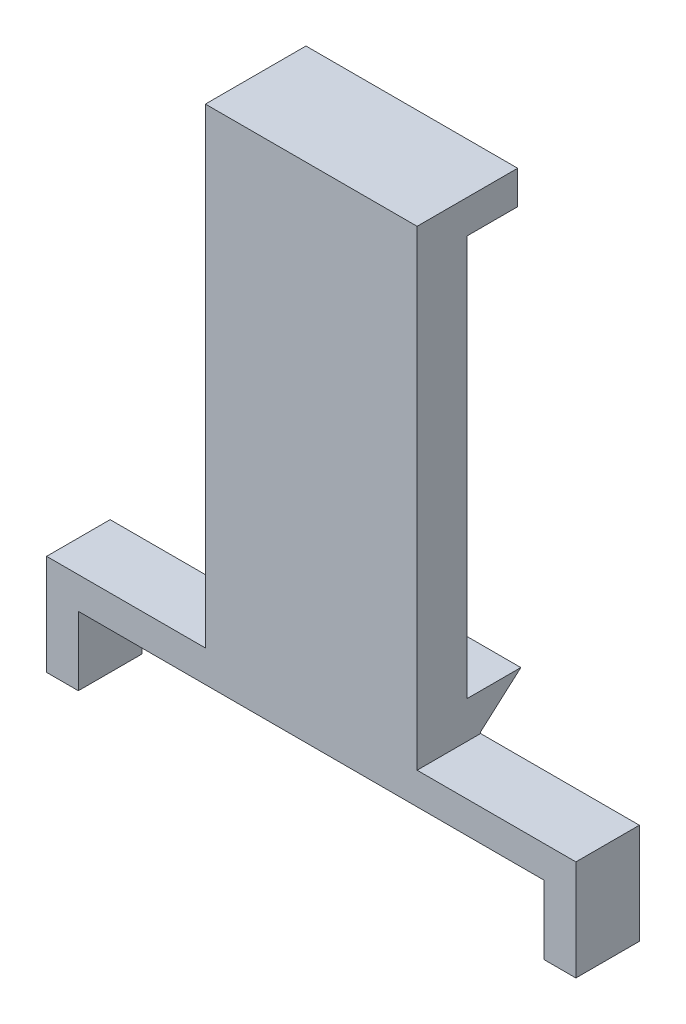
ISO-10303-21;
HEADER;
FILE_DESCRIPTION(('STEP AP214'),'2;1');
FILE_NAME('part.step','',(''),(''),'','','');
FILE_SCHEMA(('AUTOMOTIVE_DESIGN { 1 0 10303 214 1 1 1 1 }'));
ENDSEC;
DATA;
#1=APPLICATION_CONTEXT('core data for automotive mechanical design processes');
#2=APPLICATION_PROTOCOL_DEFINITION('international standard','automotive_design',2000,#1);
#3=PRODUCT_CONTEXT('',#1,'mechanical');
#4=PRODUCT('Part','Part','',(#3));
#5=PRODUCT_RELATED_PRODUCT_CATEGORY('part','',(#4));
#6=PRODUCT_DEFINITION_FORMATION('','',#4);
#7=PRODUCT_DEFINITION_CONTEXT('part definition',#1,'design');
#8=PRODUCT_DEFINITION('design','',#6,#7);
#9=PRODUCT_DEFINITION_SHAPE('','',#8);
#10=(LENGTH_UNIT() NAMED_UNIT(*) SI_UNIT(.MILLI.,.METRE.));
#11=(NAMED_UNIT(*) PLANE_ANGLE_UNIT() SI_UNIT($,.RADIAN.));
#12=(NAMED_UNIT(*) SI_UNIT($,.STERADIAN.) SOLID_ANGLE_UNIT());
#13=UNCERTAINTY_MEASURE_WITH_UNIT(LENGTH_MEASURE(1.E-05),#10,'distance_accuracy_value','');
#14=(GEOMETRIC_REPRESENTATION_CONTEXT(3) GLOBAL_UNCERTAINTY_ASSIGNED_CONTEXT((#13)) GLOBAL_UNIT_ASSIGNED_CONTEXT((#10,
#11,#12)) REPRESENTATION_CONTEXT('',''));
#15=CARTESIAN_POINT('',(0.,0.,0.));
#16=DIRECTION('',(0.,0.,1.));
#17=DIRECTION('',(1.,0.,0.));
#18=AXIS2_PLACEMENT_3D('',#15,#16,#17);
#19=CARTESIAN_POINT('',(20.,-6.5,9.8));
#20=DIRECTION('',(0.,1.,0.));
#21=DIRECTION('',(0.,0.,1.));
#22=AXIS2_PLACEMENT_3D('',#19,#20,#21);
#23=PLANE('',#22);
#24=DIRECTION('',(-1.,0.,0.));
#25=VECTOR('',#24,1.);
#26=CARTESIAN_POINT('',(20.,-6.5,9.8));
#27=LINE('',#26,#25);
#28=CARTESIAN_POINT('',(32.,-6.5,9.8));
#29=VERTEX_POINT('',#28);
#30=CARTESIAN_POINT('',(-12.,-6.5,9.8));
#31=VERTEX_POINT('',#30);
#32=EDGE_CURVE('E288',#29,#31,#27,.T.);
#33=ORIENTED_EDGE('',*,*,#32,.T.);
#34=DIRECTION('',(0.,0.,-1.));
#35=VECTOR('',#34,1.);
#36=CARTESIAN_POINT('',(-12.,-6.5,9.8));
#37=LINE('',#36,#35);
#38=CARTESIAN_POINT('',(-12.,-6.5,3.8));
#39=VERTEX_POINT('',#38);
#40=EDGE_CURVE('E175',#31,#39,#37,.T.);
#41=ORIENTED_EDGE('',*,*,#40,.T.);
#42=DIRECTION('',(-1.,0.,0.));
#43=VECTOR('',#42,1.);
#44=CARTESIAN_POINT('',(20.,-6.5,3.8));
#45=LINE('',#44,#43);
#46=CARTESIAN_POINT('',(32.,-6.5,3.8));
#47=VERTEX_POINT('',#46);
#48=EDGE_CURVE('E181',#47,#39,#45,.T.);
#49=ORIENTED_EDGE('',*,*,#48,.F.);
#50=DIRECTION('',(0.,0.,-1.));
#51=VECTOR('',#50,1.);
#52=CARTESIAN_POINT('',(32.,-6.5,9.8));
#53=LINE('',#52,#51);
#54=EDGE_CURVE('E66',#29,#47,#53,.T.);
#55=ORIENTED_EDGE('',*,*,#54,.F.);
#56=EDGE_LOOP('',(#33,#41,#49,#55));
#57=FACE_BOUND('',#56,.T.);
#58=ADVANCED_FACE('F43',(#57),#23,.F.);
#59=CARTESIAN_POINT('',(20.,41.,0.300000000000007));
#60=DIRECTION('',(0.,-1.,0.));
#61=DIRECTION('',(0.,0.,-1.));
#62=AXIS2_PLACEMENT_3D('',#59,#60,#61);
#63=PLANE('',#62);
#64=DIRECTION('',(0.,0.,1.));
#65=VECTOR('',#64,1.);
#66=CARTESIAN_POINT('',(0.,41.,0.300000000000007));
#67=LINE('',#66,#65);
#68=CARTESIAN_POINT('',(0.,41.,0.300000000000007));
#69=VERTEX_POINT('',#68);
#70=CARTESIAN_POINT('',(0.,41.,9.80000000000001));
#71=VERTEX_POINT('',#70);
#72=EDGE_CURVE('E234',#69,#71,#67,.T.);
#73=ORIENTED_EDGE('',*,*,#72,.T.);
#74=DIRECTION('',(-1.,0.,0.));
#75=VECTOR('',#74,1.);
#76=CARTESIAN_POINT('',(20.,41.,9.80000000000001));
#77=LINE('',#76,#75);
#78=CARTESIAN_POINT('',(20.,41.,9.80000000000001));
#79=VERTEX_POINT('',#78);
#80=EDGE_CURVE('E51',#79,#71,#77,.T.);
#81=ORIENTED_EDGE('',*,*,#80,.F.);
#82=DIRECTION('',(0.,0.,1.));
#83=VECTOR('',#82,1.);
#84=CARTESIAN_POINT('',(20.,41.,0.300000000000007));
#85=LINE('',#84,#83);
#86=CARTESIAN_POINT('',(20.,41.,0.300000000000007));
#87=VERTEX_POINT('',#86);
#88=EDGE_CURVE('E235',#87,#79,#85,.T.);
#89=ORIENTED_EDGE('',*,*,#88,.F.);
#90=DIRECTION('',(-1.,0.,0.));
#91=VECTOR('',#90,1.);
#92=CARTESIAN_POINT('',(20.,41.,0.300000000000007));
#93=LINE('',#92,#91);
#94=EDGE_CURVE('E253',#87,#69,#93,.T.);
#95=ORIENTED_EDGE('',*,*,#94,.T.);
#96=EDGE_LOOP('',(#73,#81,#89,#95));
#97=FACE_BOUND('',#96,.T.);
#98=ADVANCED_FACE('F45',(#97),#63,.F.);
#99=CARTESIAN_POINT('',(20.,41.,9.80000000000001));
#100=DIRECTION('',(0.,0.,-1.));
#101=DIRECTION('',(0.,1.,0.));
#102=AXIS2_PLACEMENT_3D('',#99,#100,#101);
#103=PLANE('',#102);
#104=DIRECTION('',(0.,-1.,0.));
#105=VECTOR('',#104,1.);
#106=CARTESIAN_POINT('',(0.,41.,9.80000000000001));
#107=LINE('',#106,#105);
#108=CARTESIAN_POINT('',(0.,-3.5,9.8));
#109=VERTEX_POINT('',#108);
#110=EDGE_CURVE('E256',#71,#109,#107,.T.);
#111=ORIENTED_EDGE('',*,*,#110,.T.);
#112=DIRECTION('',(1.,0.,0.));
#113=VECTOR('',#112,1.);
#114=CARTESIAN_POINT('',(-5.,-3.5,9.8));
#115=LINE('',#114,#113);
#116=CARTESIAN_POINT('',(-15.,-3.5,9.8));
#117=VERTEX_POINT('',#116);
#118=EDGE_CURVE('E229',#117,#109,#115,.T.);
#119=ORIENTED_EDGE('',*,*,#118,.F.);
#120=DIRECTION('',(0.,-1.,0.));
#121=VECTOR('',#120,1.);
#122=CARTESIAN_POINT('',(-15.,-3.49999999999999,9.8));
#123=LINE('',#122,#121);
#124=CARTESIAN_POINT('',(-15.,-13.,9.8));
#125=VERTEX_POINT('',#124);
#126=EDGE_CURVE('E210',#117,#125,#123,.T.);
#127=ORIENTED_EDGE('',*,*,#126,.T.);
#128=DIRECTION('',(1.,0.,0.));
#129=VECTOR('',#128,1.);
#130=CARTESIAN_POINT('',(-15.,-13.,9.8));
#131=LINE('',#130,#129);
#132=CARTESIAN_POINT('',(-12.,-13.,9.8));
#133=VERTEX_POINT('',#132);
#134=EDGE_CURVE('E186',#125,#133,#131,.T.);
#135=ORIENTED_EDGE('',*,*,#134,.T.);
#136=DIRECTION('',(0.,1.,0.));
#137=VECTOR('',#136,1.);
#138=CARTESIAN_POINT('',(-12.,-13.,9.8));
#139=LINE('',#138,#137);
#140=EDGE_CURVE('E183',#133,#31,#139,.T.);
#141=ORIENTED_EDGE('',*,*,#140,.T.);
#142=ORIENTED_EDGE('',*,*,#32,.F.);
#143=DIRECTION('',(0.,1.,0.));
#144=VECTOR('',#143,1.);
#145=CARTESIAN_POINT('',(32.,-13.,9.8));
#146=LINE('',#145,#144);
#147=CARTESIAN_POINT('',(32.,-13.,9.8));
#148=VERTEX_POINT('',#147);
#149=EDGE_CURVE('E193',#148,#29,#146,.T.);
#150=ORIENTED_EDGE('',*,*,#149,.F.);
#151=DIRECTION('',(-1.,0.,0.));
#152=VECTOR('',#151,1.);
#153=CARTESIAN_POINT('',(35.,-13.,9.8));
#154=LINE('',#153,#152);
#155=CARTESIAN_POINT('',(35.,-13.,9.8));
#156=VERTEX_POINT('',#155);
#157=EDGE_CURVE('E200',#156,#148,#154,.T.);
#158=ORIENTED_EDGE('',*,*,#157,.F.);
#159=DIRECTION('',(0.,1.,0.));
#160=VECTOR('',#159,1.);
#161=CARTESIAN_POINT('',(35.,-3.49999999999999,9.8));
#162=LINE('',#161,#160);
#163=CARTESIAN_POINT('',(35.,-3.5,9.8));
#164=VERTEX_POINT('',#163);
#165=EDGE_CURVE('E212',#156,#164,#162,.T.);
#166=ORIENTED_EDGE('',*,*,#165,.T.);
#167=CARTESIAN_POINT('',(20.,-3.5,9.8));
#168=VERTEX_POINT('',#167);
#169=EDGE_CURVE('E228',#168,#164,#115,.T.);
#170=ORIENTED_EDGE('',*,*,#169,.F.);
#171=DIRECTION('',(0.,-1.,0.));
#172=VECTOR('',#171,1.);
#173=CARTESIAN_POINT('',(20.,41.,9.80000000000001));
#174=LINE('',#173,#172);
#175=EDGE_CURVE('E238',#79,#168,#174,.T.);
#176=ORIENTED_EDGE('',*,*,#175,.F.);
#177=ORIENTED_EDGE('',*,*,#80,.T.);
#178=EDGE_LOOP('',(#111,#119,#127,#135,#141,#142,#150,#158,#166,#170,#176,#177));
#179=FACE_BOUND('',#178,.T.);
#180=ADVANCED_FACE('F292',(#179),#103,.F.);
#181=CARTESIAN_POINT('',(20.,-6.5,3.8));
#182=DIRECTION('',(0.,0.,1.));
#183=DIRECTION('',(0.,-1.,0.));
#184=AXIS2_PLACEMENT_3D('',#181,#182,#183);
#185=PLANE('',#184);
#186=DIRECTION('',(0.,1.,0.));
#187=VECTOR('',#186,1.);
#188=CARTESIAN_POINT('',(20.,-6.5,3.8));
#189=LINE('',#188,#187);
#190=CARTESIAN_POINT('',(20.,-3.5,3.8));
#191=VERTEX_POINT('',#190);
#192=CARTESIAN_POINT('',(20.,-3.3570820663189,3.8));
#193=VERTEX_POINT('',#192);
#194=EDGE_CURVE('E241',#191,#193,#189,.T.);
#195=ORIENTED_EDGE('',*,*,#194,.F.);
#196=DIRECTION('',(1.,0.,0.));
#197=VECTOR('',#196,1.);
#198=CARTESIAN_POINT('',(-5.,-3.5,3.8));
#199=LINE('',#198,#197);
#200=CARTESIAN_POINT('',(35.,-3.5,3.8));
#201=VERTEX_POINT('',#200);
#202=EDGE_CURVE('E216',#191,#201,#199,.T.);
#203=ORIENTED_EDGE('',*,*,#202,.T.);
#204=DIRECTION('',(0.,-1.,0.));
#205=VECTOR('',#204,1.);
#206=CARTESIAN_POINT('',(35.,-3.5,3.8));
#207=LINE('',#206,#205);
#208=CARTESIAN_POINT('',(35.,-13.,3.8));
#209=VERTEX_POINT('',#208);
#210=EDGE_CURVE('E182',#201,#209,#207,.T.);
#211=ORIENTED_EDGE('',*,*,#210,.T.);
#212=DIRECTION('',(-1.,0.,0.));
#213=VECTOR('',#212,1.);
#214=CARTESIAN_POINT('',(35.,-13.,3.8));
#215=LINE('',#214,#213);
#216=CARTESIAN_POINT('',(32.,-13.,3.8));
#217=VERTEX_POINT('',#216);
#218=EDGE_CURVE('E203',#209,#217,#215,.T.);
#219=ORIENTED_EDGE('',*,*,#218,.T.);
#220=DIRECTION('',(0.,1.,0.));
#221=VECTOR('',#220,1.);
#222=CARTESIAN_POINT('',(32.,-13.,3.8));
#223=LINE('',#222,#221);
#224=EDGE_CURVE('E196',#217,#47,#223,.T.);
#225=ORIENTED_EDGE('',*,*,#224,.T.);
#226=ORIENTED_EDGE('',*,*,#48,.T.);
#227=DIRECTION('',(0.,1.,0.));
#228=VECTOR('',#227,1.);
#229=CARTESIAN_POINT('',(-12.,-13.,3.8));
#230=LINE('',#229,#228);
#231=CARTESIAN_POINT('',(-12.,-13.,3.8));
#232=VERTEX_POINT('',#231);
#233=EDGE_CURVE('E58',#232,#39,#230,.T.);
#234=ORIENTED_EDGE('',*,*,#233,.F.);
#235=DIRECTION('',(1.,0.,0.));
#236=VECTOR('',#235,1.);
#237=CARTESIAN_POINT('',(-15.,-13.,3.8));
#238=LINE('',#237,#236);
#239=CARTESIAN_POINT('',(-15.,-13.,3.8));
#240=VERTEX_POINT('',#239);
#241=EDGE_CURVE('E166',#240,#232,#238,.T.);
#242=ORIENTED_EDGE('',*,*,#241,.F.);
#243=DIRECTION('',(0.,1.,0.));
#244=VECTOR('',#243,1.);
#245=CARTESIAN_POINT('',(-15.,-3.5,3.8));
#246=LINE('',#245,#244);
#247=CARTESIAN_POINT('',(-15.,-3.5,3.8));
#248=VERTEX_POINT('',#247);
#249=EDGE_CURVE('E218',#240,#248,#246,.T.);
#250=ORIENTED_EDGE('',*,*,#249,.T.);
#251=CARTESIAN_POINT('',(0.,-3.5,3.8));
#252=VERTEX_POINT('',#251);
#253=EDGE_CURVE('E225',#248,#252,#199,.T.);
#254=ORIENTED_EDGE('',*,*,#253,.T.);
#255=DIRECTION('',(0.,1.,0.));
#256=VECTOR('',#255,1.);
#257=CARTESIAN_POINT('',(0.,-6.5,3.8));
#258=LINE('',#257,#256);
#259=CARTESIAN_POINT('',(0.,-3.3570820663189,3.8));
#260=VERTEX_POINT('',#259);
#261=EDGE_CURVE('E259',#252,#260,#258,.T.);
#262=ORIENTED_EDGE('',*,*,#261,.T.);
#263=DIRECTION('',(-1.,0.,0.));
#264=VECTOR('',#263,1.);
#265=CARTESIAN_POINT('',(20.,-3.3570820663189,3.8));
#266=LINE('',#265,#264);
#267=EDGE_CURVE('E284',#193,#260,#266,.T.);
#268=ORIENTED_EDGE('',*,*,#267,.F.);
#269=EDGE_LOOP('',(#195,#203,#211,#219,#225,#226,#234,#242,#250,#254,#262,#268));
#270=FACE_BOUND('',#269,.T.);
#271=ADVANCED_FACE('F179',(#270),#185,.F.);
#272=CARTESIAN_POINT('',(20.,-3.3570820663189,3.8));
#273=DIRECTION('',(0.,0.749432561175129,0.662080687114861));
#274=DIRECTION('',(0.,-0.662080687114861,0.749432561175129));
#275=AXIS2_PLACEMENT_3D('',#272,#273,#274);
#276=PLANE('',#275);
#277=DIRECTION('',(0.,0.662080687114861,-0.749432561175129));
#278=VECTOR('',#277,1.);
#279=CARTESIAN_POINT('',(0.,-3.3570820663189,3.8));
#280=LINE('',#279,#278);
#281=CARTESIAN_POINT('',(0.,0.,0.));
#282=VERTEX_POINT('',#281);
#283=EDGE_CURVE('E261',#260,#282,#280,.T.);
#284=ORIENTED_EDGE('',*,*,#283,.T.);
#285=DIRECTION('',(-1.,0.,0.));
#286=VECTOR('',#285,1.);
#287=CARTESIAN_POINT('',(20.,0.,0.));
#288=LINE('',#287,#286);
#289=CARTESIAN_POINT('',(20.,0.,0.));
#290=VERTEX_POINT('',#289);
#291=EDGE_CURVE('E281',#290,#282,#288,.T.);
#292=ORIENTED_EDGE('',*,*,#291,.F.);
#293=DIRECTION('',(0.,0.662080687114861,-0.749432561175129));
#294=VECTOR('',#293,1.);
#295=CARTESIAN_POINT('',(20.,-3.3570820663189,3.8));
#296=LINE('',#295,#294);
#297=EDGE_CURVE('E243',#193,#290,#296,.T.);
#298=ORIENTED_EDGE('',*,*,#297,.F.);
#299=ORIENTED_EDGE('',*,*,#267,.T.);
#300=EDGE_LOOP('',(#284,#292,#298,#299));
#301=FACE_BOUND('',#300,.T.);
#302=ADVANCED_FACE('F324',(#301),#276,.F.);
#303=CARTESIAN_POINT('',(20.,0.,0.));
#304=DIRECTION('',(0.,-1.,0.));
#305=DIRECTION('',(0.,0.,-1.));
#306=AXIS2_PLACEMENT_3D('',#303,#304,#305);
#307=PLANE('',#306);
#308=DIRECTION('',(0.,0.,1.));
#309=VECTOR('',#308,1.);
#310=CARTESIAN_POINT('',(0.,0.,0.));
#311=LINE('',#310,#309);
#312=CARTESIAN_POINT('',(0.,0.,5.1));
#313=VERTEX_POINT('',#312);
#314=EDGE_CURVE('E263',#282,#313,#311,.T.);
#315=ORIENTED_EDGE('',*,*,#314,.T.);
#316=DIRECTION('',(-1.,0.,0.));
#317=VECTOR('',#316,1.);
#318=CARTESIAN_POINT('',(20.,0.,5.1));
#319=LINE('',#318,#317);
#320=CARTESIAN_POINT('',(20.,0.,5.1));
#321=VERTEX_POINT('',#320);
#322=EDGE_CURVE('E278',#321,#313,#319,.T.);
#323=ORIENTED_EDGE('',*,*,#322,.F.);
#324=DIRECTION('',(0.,0.,1.));
#325=VECTOR('',#324,1.);
#326=CARTESIAN_POINT('',(20.,0.,0.));
#327=LINE('',#326,#325);
#328=EDGE_CURVE('E245',#290,#321,#327,.T.);
#329=ORIENTED_EDGE('',*,*,#328,.F.);
#330=ORIENTED_EDGE('',*,*,#291,.T.);
#331=EDGE_LOOP('',(#315,#323,#329,#330));
#332=FACE_BOUND('',#331,.T.);
#333=ADVANCED_FACE('F329',(#332),#307,.F.);
#334=CARTESIAN_POINT('',(20.,0.,5.1));
#335=DIRECTION('',(0.,0.,1.));
#336=DIRECTION('',(1.,0.,0.));
#337=AXIS2_PLACEMENT_3D('',#334,#335,#336);
#338=PLANE('',#337);
#339=DIRECTION('',(0.,1.,0.));
#340=VECTOR('',#339,1.);
#341=CARTESIAN_POINT('',(0.,0.,5.1));
#342=LINE('',#341,#340);
#343=CARTESIAN_POINT('',(0.,37.85,5.1));
#344=VERTEX_POINT('',#343);
#345=EDGE_CURVE('E265',#313,#344,#342,.T.);
#346=ORIENTED_EDGE('',*,*,#345,.T.);
#347=DIRECTION('',(-1.,0.,0.));
#348=VECTOR('',#347,1.);
#349=CARTESIAN_POINT('',(20.,37.85,5.1));
#350=LINE('',#349,#348);
#351=CARTESIAN_POINT('',(20.,37.85,5.1));
#352=VERTEX_POINT('',#351);
#353=EDGE_CURVE('E275',#352,#344,#350,.T.);
#354=ORIENTED_EDGE('',*,*,#353,.F.);
#355=DIRECTION('',(0.,1.,0.));
#356=VECTOR('',#355,1.);
#357=CARTESIAN_POINT('',(20.,0.,5.1));
#358=LINE('',#357,#356);
#359=EDGE_CURVE('E247',#321,#352,#358,.T.);
#360=ORIENTED_EDGE('',*,*,#359,.F.);
#361=ORIENTED_EDGE('',*,*,#322,.T.);
#362=EDGE_LOOP('',(#346,#354,#360,#361));
#363=FACE_BOUND('',#362,.T.);
#364=ADVANCED_FACE('F334',(#363),#338,.F.);
#365=CARTESIAN_POINT('',(20.,37.85,5.1));
#366=DIRECTION('',(0.,1.,0.));
#367=DIRECTION('',(0.,0.,1.));
#368=AXIS2_PLACEMENT_3D('',#365,#366,#367);
#369=PLANE('',#368);
#370=DIRECTION('',(0.,0.,-1.));
#371=VECTOR('',#370,1.);
#372=CARTESIAN_POINT('',(0.,37.85,5.1));
#373=LINE('',#372,#371);
#374=CARTESIAN_POINT('',(0.,37.85,0.300000000000007));
#375=VERTEX_POINT('',#374);
#376=EDGE_CURVE('E267',#344,#375,#373,.T.);
#377=ORIENTED_EDGE('',*,*,#376,.T.);
#378=DIRECTION('',(-1.,0.,0.));
#379=VECTOR('',#378,1.);
#380=CARTESIAN_POINT('',(20.,37.85,0.300000000000007));
#381=LINE('',#380,#379);
#382=CARTESIAN_POINT('',(20.,37.85,0.300000000000007));
#383=VERTEX_POINT('',#382);
#384=EDGE_CURVE('E272',#383,#375,#381,.T.);
#385=ORIENTED_EDGE('',*,*,#384,.F.);
#386=DIRECTION('',(0.,0.,-1.));
#387=VECTOR('',#386,1.);
#388=CARTESIAN_POINT('',(20.,37.85,5.1));
#389=LINE('',#388,#387);
#390=EDGE_CURVE('E249',#352,#383,#389,.T.);
#391=ORIENTED_EDGE('',*,*,#390,.F.);
#392=ORIENTED_EDGE('',*,*,#353,.T.);
#393=EDGE_LOOP('',(#377,#385,#391,#392));
#394=FACE_BOUND('',#393,.T.);
#395=ADVANCED_FACE('F340',(#394),#369,.F.);
#396=CARTESIAN_POINT('',(20.,37.85,0.300000000000007));
#397=DIRECTION('',(0.,0.,1.));
#398=DIRECTION('',(1.,0.,0.));
#399=AXIS2_PLACEMENT_3D('',#396,#397,#398);
#400=PLANE('',#399);
#401=DIRECTION('',(0.,1.,0.));
#402=VECTOR('',#401,1.);
#403=CARTESIAN_POINT('',(0.,37.85,0.300000000000007));
#404=LINE('',#403,#402);
#405=EDGE_CURVE('E239',#375,#69,#404,.T.);
#406=ORIENTED_EDGE('',*,*,#405,.T.);
#407=ORIENTED_EDGE('',*,*,#94,.F.);
#408=DIRECTION('',(0.,1.,0.));
#409=VECTOR('',#408,1.);
#410=CARTESIAN_POINT('',(20.,37.85,0.300000000000007));
#411=LINE('',#410,#409);
#412=EDGE_CURVE('E251',#383,#87,#411,.T.);
#413=ORIENTED_EDGE('',*,*,#412,.F.);
#414=ORIENTED_EDGE('',*,*,#384,.T.);
#415=EDGE_LOOP('',(#406,#407,#413,#414));
#416=FACE_BOUND('',#415,.T.);
#417=ADVANCED_FACE('F344',(#416),#400,.F.);
#418=CARTESIAN_POINT('',(20.,0.,0.));
#419=DIRECTION('',(1.,0.,0.));
#420=DIRECTION('',(0.,0.,-1.));
#421=AXIS2_PLACEMENT_3D('',#418,#419,#420);
#422=PLANE('',#421);
#423=DIRECTION('',(0.,0.,1.));
#424=VECTOR('',#423,1.);
#425=CARTESIAN_POINT('',(20.,-3.5,0.));
#426=LINE('',#425,#424);
#427=EDGE_CURVE('E231',#191,#168,#426,.T.);
#428=ORIENTED_EDGE('',*,*,#427,.F.);
#429=ORIENTED_EDGE('',*,*,#194,.T.);
#430=ORIENTED_EDGE('',*,*,#297,.T.);
#431=ORIENTED_EDGE('',*,*,#328,.T.);
#432=ORIENTED_EDGE('',*,*,#359,.T.);
#433=ORIENTED_EDGE('',*,*,#390,.T.);
#434=ORIENTED_EDGE('',*,*,#412,.T.);
#435=ORIENTED_EDGE('',*,*,#88,.T.);
#436=ORIENTED_EDGE('',*,*,#175,.T.);
#437=EDGE_LOOP('',(#428,#429,#430,#431,#432,#433,#434,#435,#436));
#438=FACE_BOUND('',#437,.T.);
#439=ADVANCED_FACE('F348',(#438),#422,.T.);
#440=CARTESIAN_POINT('',(0.,0.,0.));
#441=DIRECTION('',(1.,0.,0.));
#442=DIRECTION('',(0.,0.,-1.));
#443=AXIS2_PLACEMENT_3D('',#440,#441,#442);
#444=PLANE('',#443);
#445=ORIENTED_EDGE('',*,*,#261,.F.);
#446=DIRECTION('',(0.,0.,1.));
#447=VECTOR('',#446,1.);
#448=CARTESIAN_POINT('',(0.,-3.5,0.));
#449=LINE('',#448,#447);
#450=EDGE_CURVE('E11',#252,#109,#449,.T.);
#451=ORIENTED_EDGE('',*,*,#450,.T.);
#452=ORIENTED_EDGE('',*,*,#110,.F.);
#453=ORIENTED_EDGE('',*,*,#72,.F.);
#454=ORIENTED_EDGE('',*,*,#405,.F.);
#455=ORIENTED_EDGE('',*,*,#376,.F.);
#456=ORIENTED_EDGE('',*,*,#345,.F.);
#457=ORIENTED_EDGE('',*,*,#314,.F.);
#458=ORIENTED_EDGE('',*,*,#283,.F.);
#459=EDGE_LOOP('',(#445,#451,#452,#453,#454,#455,#456,#457,#458));
#460=FACE_BOUND('',#459,.T.);
#461=ADVANCED_FACE('F301',(#460),#444,.F.);
#462=CARTESIAN_POINT('',(0.,-3.5,0.));
#463=DIRECTION('',(0.,1.,0.));
#464=DIRECTION('',(0.,0.,1.));
#465=AXIS2_PLACEMENT_3D('',#462,#463,#464);
#466=PLANE('',#465);
#467=ORIENTED_EDGE('',*,*,#450,.F.);
#468=ORIENTED_EDGE('',*,*,#253,.F.);
#469=DIRECTION('',(0.,0.,-1.));
#470=VECTOR('',#469,1.);
#471=CARTESIAN_POINT('',(-15.,-3.5,59.8899191454728));
#472=LINE('',#471,#470);
#473=EDGE_CURVE('E220',#117,#248,#472,.T.);
#474=ORIENTED_EDGE('',*,*,#473,.F.);
#475=ORIENTED_EDGE('',*,*,#118,.T.);
#476=EDGE_LOOP('',(#467,#468,#474,#475));
#477=FACE_BOUND('',#476,.T.);
#478=ADVANCED_FACE('F305',(#477),#466,.T.);
#479=ORIENTED_EDGE('',*,*,#202,.F.);
#480=ORIENTED_EDGE('',*,*,#427,.T.);
#481=ORIENTED_EDGE('',*,*,#169,.T.);
#482=DIRECTION('',(0.,0.,-1.));
#483=VECTOR('',#482,1.);
#484=CARTESIAN_POINT('',(35.,-3.5,59.8899191454728));
#485=LINE('',#484,#483);
#486=EDGE_CURVE('E213',#164,#201,#485,.T.);
#487=ORIENTED_EDGE('',*,*,#486,.T.);
#488=EDGE_LOOP('',(#479,#480,#481,#487));
#489=FACE_BOUND('',#488,.T.);
#490=ADVANCED_FACE('F355',(#489),#466,.T.);
#491=CARTESIAN_POINT('',(35.,-3.5,59.8899191454728));
#492=DIRECTION('',(1.,0.,0.));
#493=DIRECTION('',(0.,0.,-1.));
#494=AXIS2_PLACEMENT_3D('',#491,#492,#493);
#495=PLANE('',#494);
#496=ORIENTED_EDGE('',*,*,#165,.F.);
#497=DIRECTION('',(0.,0.,-1.));
#498=VECTOR('',#497,1.);
#499=CARTESIAN_POINT('',(35.,-13.,9.8));
#500=LINE('',#499,#498);
#501=EDGE_CURVE('E198',#156,#209,#500,.T.);
#502=ORIENTED_EDGE('',*,*,#501,.T.);
#503=ORIENTED_EDGE('',*,*,#210,.F.);
#504=ORIENTED_EDGE('',*,*,#486,.F.);
#505=EDGE_LOOP('',(#496,#502,#503,#504));
#506=FACE_BOUND('',#505,.T.);
#507=ADVANCED_FACE('F357',(#506),#495,.T.);
#508=CARTESIAN_POINT('',(-15.,-3.5,59.8899191454728));
#509=DIRECTION('',(-1.,0.,0.));
#510=DIRECTION('',(0.,0.,1.));
#511=AXIS2_PLACEMENT_3D('',#508,#509,#510);
#512=PLANE('',#511);
#513=ORIENTED_EDGE('',*,*,#126,.F.);
#514=ORIENTED_EDGE('',*,*,#473,.T.);
#515=ORIENTED_EDGE('',*,*,#249,.F.);
#516=DIRECTION('',(0.,0.,-1.));
#517=VECTOR('',#516,1.);
#518=CARTESIAN_POINT('',(-15.,-13.,9.8));
#519=LINE('',#518,#517);
#520=EDGE_CURVE('E172',#125,#240,#519,.T.);
#521=ORIENTED_EDGE('',*,*,#520,.F.);
#522=EDGE_LOOP('',(#513,#514,#515,#521));
#523=FACE_BOUND('',#522,.T.);
#524=ADVANCED_FACE('F310',(#523),#512,.T.);
#525=CARTESIAN_POINT('',(32.,-13.,9.8));
#526=DIRECTION('',(1.,0.,0.));
#527=DIRECTION('',(0.,0.,-1.));
#528=AXIS2_PLACEMENT_3D('',#525,#526,#527);
#529=PLANE('',#528);
#530=ORIENTED_EDGE('',*,*,#54,.T.);
#531=ORIENTED_EDGE('',*,*,#224,.F.);
#532=DIRECTION('',(0.,0.,-1.));
#533=VECTOR('',#532,1.);
#534=CARTESIAN_POINT('',(32.,-13.,9.8));
#535=LINE('',#534,#533);
#536=EDGE_CURVE('E206',#148,#217,#535,.T.);
#537=ORIENTED_EDGE('',*,*,#536,.F.);
#538=ORIENTED_EDGE('',*,*,#149,.T.);
#539=EDGE_LOOP('',(#530,#531,#537,#538));
#540=FACE_BOUND('',#539,.T.);
#541=ADVANCED_FACE('F363',(#540),#529,.F.);
#542=CARTESIAN_POINT('',(0.,-13.,0.));
#543=DIRECTION('',(0.,-1.,0.));
#544=DIRECTION('',(0.,0.,-1.));
#545=AXIS2_PLACEMENT_3D('',#542,#543,#544);
#546=PLANE('',#545);
#547=ORIENTED_EDGE('',*,*,#157,.T.);
#548=ORIENTED_EDGE('',*,*,#536,.T.);
#549=ORIENTED_EDGE('',*,*,#218,.F.);
#550=ORIENTED_EDGE('',*,*,#501,.F.);
#551=EDGE_LOOP('',(#547,#548,#549,#550));
#552=FACE_BOUND('',#551,.T.);
#553=ADVANCED_FACE('F364',(#552),#546,.T.);
#554=CARTESIAN_POINT('',(-12.,-13.,9.8));
#555=DIRECTION('',(1.,0.,0.));
#556=DIRECTION('',(0.,0.,-1.));
#557=AXIS2_PLACEMENT_3D('',#554,#555,#556);
#558=PLANE('',#557);
#559=ORIENTED_EDGE('',*,*,#40,.F.);
#560=ORIENTED_EDGE('',*,*,#140,.F.);
#561=DIRECTION('',(0.,0.,-1.));
#562=VECTOR('',#561,1.);
#563=CARTESIAN_POINT('',(-12.,-13.,9.8));
#564=LINE('',#563,#562);
#565=EDGE_CURVE('E169',#133,#232,#564,.T.);
#566=ORIENTED_EDGE('',*,*,#565,.T.);
#567=ORIENTED_EDGE('',*,*,#233,.T.);
#568=EDGE_LOOP('',(#559,#560,#566,#567));
#569=FACE_BOUND('',#568,.T.);
#570=ADVANCED_FACE('F185',(#569),#558,.T.);
#571=CARTESIAN_POINT('',(0.,-13.,0.));
#572=DIRECTION('',(0.,1.,0.));
#573=DIRECTION('',(0.,0.,1.));
#574=AXIS2_PLACEMENT_3D('',#571,#572,#573);
#575=PLANE('',#574);
#576=ORIENTED_EDGE('',*,*,#241,.T.);
#577=ORIENTED_EDGE('',*,*,#565,.F.);
#578=ORIENTED_EDGE('',*,*,#134,.F.);
#579=ORIENTED_EDGE('',*,*,#520,.T.);
#580=EDGE_LOOP('',(#576,#577,#578,#579));
#581=FACE_BOUND('',#580,.T.);
#582=ADVANCED_FACE('F167',(#581),#575,.F.);
#583=CLOSED_SHELL('',(#58,#98,#180,#271,#302,#333,#364,#395,#417,#439,#461,#478,#490,#507,#524,
#541,#553,#570,#582));
#584=MANIFOLD_SOLID_BREP('B2',#583);
#585=ADVANCED_BREP_SHAPE_REPRESENTATION('',(#18,#584),#14);
#586=SHAPE_DEFINITION_REPRESENTATION(#9,#585);
ENDSEC;
END-ISO-10303-21;
